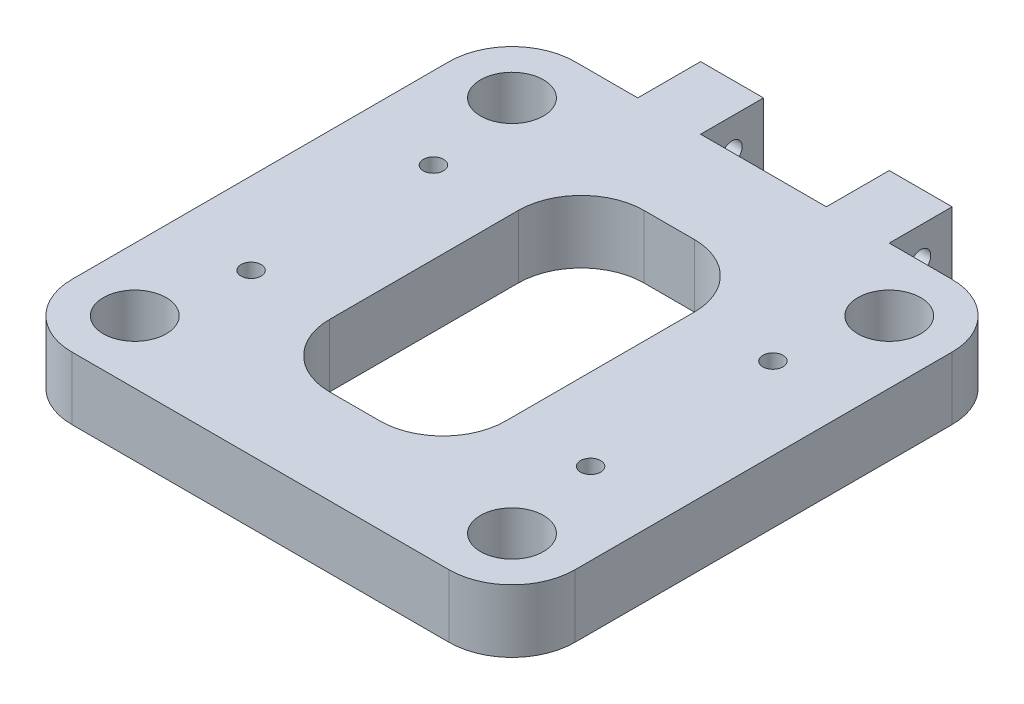
ISO-10303-21;
HEADER;
FILE_DESCRIPTION(('STEP AP214'),'2;1');
FILE_NAME('part.step','',(''),(''),'','','');
FILE_SCHEMA(('AUTOMOTIVE_DESIGN { 1 0 10303 214 1 1 1 1 }'));
ENDSEC;
DATA;
#1=APPLICATION_CONTEXT('core data for automotive mechanical design processes');
#2=APPLICATION_PROTOCOL_DEFINITION('international standard','automotive_design',2000,#1);
#3=PRODUCT_CONTEXT('',#1,'mechanical');
#4=PRODUCT('Part','Part','',(#3));
#5=PRODUCT_RELATED_PRODUCT_CATEGORY('part','',(#4));
#6=PRODUCT_DEFINITION_FORMATION('','',#4);
#7=PRODUCT_DEFINITION_CONTEXT('part definition',#1,'design');
#8=PRODUCT_DEFINITION('design','',#6,#7);
#9=PRODUCT_DEFINITION_SHAPE('','',#8);
#10=(LENGTH_UNIT() NAMED_UNIT(*) SI_UNIT(.MILLI.,.METRE.));
#11=(NAMED_UNIT(*) PLANE_ANGLE_UNIT() SI_UNIT($,.RADIAN.));
#12=(NAMED_UNIT(*) SI_UNIT($,.STERADIAN.) SOLID_ANGLE_UNIT());
#13=UNCERTAINTY_MEASURE_WITH_UNIT(LENGTH_MEASURE(1.E-05),#10,'distance_accuracy_value','');
#14=(GEOMETRIC_REPRESENTATION_CONTEXT(3) GLOBAL_UNCERTAINTY_ASSIGNED_CONTEXT((#13)) GLOBAL_UNIT_ASSIGNED_CONTEXT((#10,
#11,#12)) REPRESENTATION_CONTEXT('',''));
#15=CARTESIAN_POINT('',(0.,0.,0.));
#16=DIRECTION('',(0.,0.,1.));
#17=DIRECTION('',(1.,0.,0.));
#18=AXIS2_PLACEMENT_3D('',#15,#16,#17);
#19=CARTESIAN_POINT('',(-40.,10.,-40.));
#20=DIRECTION('',(0.,0.,1.));
#21=DIRECTION('',(1.,0.,0.));
#22=AXIS2_PLACEMENT_3D('',#19,#20,#21);
#23=PLANE('',#22);
#24=DIRECTION('',(0.,-1.,0.));
#25=VECTOR('',#24,1.);
#26=CARTESIAN_POINT('',(-10.,10.,-40.));
#27=LINE('',#26,#25);
#28=CARTESIAN_POINT('',(-10.,10.,-40.));
#29=VERTEX_POINT('',#28);
#30=CARTESIAN_POINT('',(-10.,0.,-40.));
#31=VERTEX_POINT('',#30);
#32=EDGE_CURVE('E57',#29,#31,#27,.T.);
#33=ORIENTED_EDGE('',*,*,#32,.F.);
#34=DIRECTION('',(-1.,0.,0.));
#35=VECTOR('',#34,1.);
#36=CARTESIAN_POINT('',(-40.,10.,-40.));
#37=LINE('',#36,#35);
#38=CARTESIAN_POINT('',(9.99999999999999,10.,-40.));
#39=VERTEX_POINT('',#38);
#40=EDGE_CURVE('E371',#39,#29,#37,.T.);
#41=ORIENTED_EDGE('',*,*,#40,.F.);
#42=DIRECTION('',(0.,1.,0.));
#43=VECTOR('',#42,1.);
#44=CARTESIAN_POINT('',(10.,10.,-40.));
#45=LINE('',#44,#43);
#46=CARTESIAN_POINT('',(10.,0.,-40.));
#47=VERTEX_POINT('',#46);
#48=EDGE_CURVE('E221',#47,#39,#45,.T.);
#49=ORIENTED_EDGE('',*,*,#48,.F.);
#50=DIRECTION('',(-1.,0.,0.));
#51=VECTOR('',#50,1.);
#52=CARTESIAN_POINT('',(-40.,0.,-40.));
#53=LINE('',#52,#51);
#54=EDGE_CURVE('E384',#47,#31,#53,.T.);
#55=ORIENTED_EDGE('',*,*,#54,.T.);
#56=EDGE_LOOP('',(#33,#41,#49,#55));
#57=FACE_BOUND('',#56,.T.);
#58=ADVANCED_FACE('F33',(#57),#23,.F.);
#59=DIRECTION('',(0.,1.,0.));
#60=VECTOR('',#59,1.);
#61=CARTESIAN_POINT('',(-20.,10.,-40.));
#62=LINE('',#61,#60);
#63=CARTESIAN_POINT('',(-20.,0.,-40.));
#64=VERTEX_POINT('',#63);
#65=CARTESIAN_POINT('',(-20.,10.,-40.));
#66=VERTEX_POINT('',#65);
#67=EDGE_CURVE('E215',#64,#66,#62,.T.);
#68=ORIENTED_EDGE('',*,*,#67,.F.);
#69=CARTESIAN_POINT('',(-30.,0.,-40.));
#70=VERTEX_POINT('',#69);
#71=EDGE_CURVE('E380',#64,#70,#53,.T.);
#72=ORIENTED_EDGE('',*,*,#71,.T.);
#73=DIRECTION('',(0.,-1.,0.));
#74=VECTOR('',#73,1.);
#75=CARTESIAN_POINT('',(-30.,10.,-40.));
#76=LINE('',#75,#74);
#77=CARTESIAN_POINT('',(-30.,10.,-40.));
#78=VERTEX_POINT('',#77);
#79=EDGE_CURVE('E405',#70,#78,#76,.F.);
#80=ORIENTED_EDGE('',*,*,#79,.T.);
#81=EDGE_CURVE('E49',#66,#78,#37,.T.);
#82=ORIENTED_EDGE('',*,*,#81,.F.);
#83=EDGE_LOOP('',(#68,#72,#80,#82));
#84=FACE_BOUND('',#83,.T.);
#85=ADVANCED_FACE('F498',(#84),#23,.F.);
#86=DIRECTION('',(0.,-1.,0.));
#87=VECTOR('',#86,1.);
#88=CARTESIAN_POINT('',(20.,10.,-40.));
#89=LINE('',#88,#87);
#90=CARTESIAN_POINT('',(20.,10.,-40.));
#91=VERTEX_POINT('',#90);
#92=CARTESIAN_POINT('',(20.,0.,-40.));
#93=VERTEX_POINT('',#92);
#94=EDGE_CURVE('E218',#91,#93,#89,.T.);
#95=ORIENTED_EDGE('',*,*,#94,.F.);
#96=CARTESIAN_POINT('',(30.,10.,-40.));
#97=VERTEX_POINT('',#96);
#98=EDGE_CURVE('E367',#97,#91,#37,.T.);
#99=ORIENTED_EDGE('',*,*,#98,.F.);
#100=DIRECTION('',(0.,-1.,0.));
#101=VECTOR('',#100,1.);
#102=CARTESIAN_POINT('',(30.,10.,-40.));
#103=LINE('',#102,#101);
#104=CARTESIAN_POINT('',(30.,0.,-40.));
#105=VERTEX_POINT('',#104);
#106=EDGE_CURVE('E402',#97,#105,#103,.T.);
#107=ORIENTED_EDGE('',*,*,#106,.T.);
#108=EDGE_CURVE('E381',#105,#93,#53,.T.);
#109=ORIENTED_EDGE('',*,*,#108,.T.);
#110=EDGE_LOOP('',(#95,#99,#107,#109));
#111=FACE_BOUND('',#110,.T.);
#112=ADVANCED_FACE('F447',(#111),#23,.F.);
#113=CARTESIAN_POINT('',(40.,10.,40.));
#114=DIRECTION('',(-1.,0.,0.));
#115=DIRECTION('',(0.,0.,1.));
#116=AXIS2_PLACEMENT_3D('',#113,#114,#115);
#117=PLANE('',#116);
#118=DIRECTION('',(0.,0.,-1.));
#119=VECTOR('',#118,1.);
#120=CARTESIAN_POINT('',(40.,0.,40.));
#121=LINE('',#120,#119);
#122=CARTESIAN_POINT('',(40.,0.,30.));
#123=VERTEX_POINT('',#122);
#124=CARTESIAN_POINT('',(40.,0.,-30.));
#125=VERTEX_POINT('',#124);
#126=EDGE_CURVE('E348',#123,#125,#121,.T.);
#127=ORIENTED_EDGE('',*,*,#126,.T.);
#128=DIRECTION('',(0.,-1.,0.));
#129=VECTOR('',#128,1.);
#130=CARTESIAN_POINT('',(40.,10.,-30.));
#131=LINE('',#130,#129);
#132=CARTESIAN_POINT('',(40.,10.,-30.));
#133=VERTEX_POINT('',#132);
#134=EDGE_CURVE('E418',#125,#133,#131,.F.);
#135=ORIENTED_EDGE('',*,*,#134,.T.);
#136=DIRECTION('',(0.,0.,-1.));
#137=VECTOR('',#136,1.);
#138=CARTESIAN_POINT('',(40.,10.,40.));
#139=LINE('',#138,#137);
#140=CARTESIAN_POINT('',(40.,10.,30.));
#141=VERTEX_POINT('',#140);
#142=EDGE_CURVE('E363',#141,#133,#139,.T.);
#143=ORIENTED_EDGE('',*,*,#142,.F.);
#144=DIRECTION('',(0.,-1.,0.));
#145=VECTOR('',#144,1.);
#146=CARTESIAN_POINT('',(40.,10.,30.));
#147=LINE('',#146,#145);
#148=EDGE_CURVE('E415',#141,#123,#147,.T.);
#149=ORIENTED_EDGE('',*,*,#148,.T.);
#150=EDGE_LOOP('',(#127,#135,#143,#149));
#151=FACE_BOUND('',#150,.T.);
#152=ADVANCED_FACE('F436',(#151),#117,.F.);
#153=CARTESIAN_POINT('',(-40.,10.,40.));
#154=DIRECTION('',(1.,0.,0.));
#155=DIRECTION('',(0.,0.,-1.));
#156=AXIS2_PLACEMENT_3D('',#153,#154,#155);
#157=PLANE('',#156);
#158=DIRECTION('',(0.,0.,1.));
#159=VECTOR('',#158,1.);
#160=CARTESIAN_POINT('',(-40.,10.,40.));
#161=LINE('',#160,#159);
#162=CARTESIAN_POINT('',(-40.,10.,-30.));
#163=VERTEX_POINT('',#162);
#164=CARTESIAN_POINT('',(-40.,10.,30.));
#165=VERTEX_POINT('',#164);
#166=EDGE_CURVE('E370',#163,#165,#161,.T.);
#167=ORIENTED_EDGE('',*,*,#166,.F.);
#168=DIRECTION('',(0.,-1.,0.));
#169=VECTOR('',#168,1.);
#170=CARTESIAN_POINT('',(-40.,10.,-30.));
#171=LINE('',#170,#169);
#172=CARTESIAN_POINT('',(-40.,0.,-30.));
#173=VERTEX_POINT('',#172);
#174=EDGE_CURVE('E390',#163,#173,#171,.T.);
#175=ORIENTED_EDGE('',*,*,#174,.T.);
#176=DIRECTION('',(0.,0.,1.));
#177=VECTOR('',#176,1.);
#178=CARTESIAN_POINT('',(-40.,0.,40.));
#179=LINE('',#178,#177);
#180=CARTESIAN_POINT('',(-40.,0.,30.));
#181=VERTEX_POINT('',#180);
#182=EDGE_CURVE('E383',#173,#181,#179,.T.);
#183=ORIENTED_EDGE('',*,*,#182,.T.);
#184=DIRECTION('',(0.,-1.,0.));
#185=VECTOR('',#184,1.);
#186=CARTESIAN_POINT('',(-40.,10.,30.));
#187=LINE('',#186,#185);
#188=EDGE_CURVE('E377',#181,#165,#187,.F.);
#189=ORIENTED_EDGE('',*,*,#188,.T.);
#190=EDGE_LOOP('',(#167,#175,#183,#189));
#191=FACE_BOUND('',#190,.T.);
#192=ADVANCED_FACE('F509',(#191),#157,.F.);
#193=CARTESIAN_POINT('',(-40.,10.,40.));
#194=DIRECTION('',(0.,0.,-1.));
#195=DIRECTION('',(-1.,0.,0.));
#196=AXIS2_PLACEMENT_3D('',#193,#194,#195);
#197=PLANE('',#196);
#198=DIRECTION('',(1.,0.,0.));
#199=VECTOR('',#198,1.);
#200=CARTESIAN_POINT('',(-40.,0.,40.));
#201=LINE('',#200,#199);
#202=CARTESIAN_POINT('',(-30.,0.,40.));
#203=VERTEX_POINT('',#202);
#204=CARTESIAN_POINT('',(30.,0.,40.));
#205=VERTEX_POINT('',#204);
#206=EDGE_CURVE('E366',#203,#205,#201,.T.);
#207=ORIENTED_EDGE('',*,*,#206,.T.);
#208=DIRECTION('',(0.,-1.,0.));
#209=VECTOR('',#208,1.);
#210=CARTESIAN_POINT('',(30.,10.,40.));
#211=LINE('',#210,#209);
#212=CARTESIAN_POINT('',(30.,10.,40.));
#213=VERTEX_POINT('',#212);
#214=EDGE_CURVE('E11',#205,#213,#211,.F.);
#215=ORIENTED_EDGE('',*,*,#214,.T.);
#216=DIRECTION('',(1.,0.,0.));
#217=VECTOR('',#216,1.);
#218=CARTESIAN_POINT('',(-40.,10.,40.));
#219=LINE('',#218,#217);
#220=CARTESIAN_POINT('',(-30.,10.,40.));
#221=VERTEX_POINT('',#220);
#222=EDGE_CURVE('E374',#221,#213,#219,.T.);
#223=ORIENTED_EDGE('',*,*,#222,.F.);
#224=DIRECTION('',(0.,-1.,0.));
#225=VECTOR('',#224,1.);
#226=CARTESIAN_POINT('',(-30.,10.,40.));
#227=LINE('',#226,#225);
#228=EDGE_CURVE('E42',#221,#203,#227,.T.);
#229=ORIENTED_EDGE('',*,*,#228,.T.);
#230=EDGE_LOOP('',(#207,#215,#223,#229));
#231=FACE_BOUND('',#230,.T.);
#232=ADVANCED_FACE('F425',(#231),#197,.F.);
#233=CARTESIAN_POINT('',(0.,10.,0.));
#234=DIRECTION('',(0.,-1.,0.));
#235=DIRECTION('',(0.,0.,-1.));
#236=AXIS2_PLACEMENT_3D('',#233,#234,#235);
#237=PLANE('',#236);
#238=CARTESIAN_POINT('',(27.,10.,-14.5));
#239=DIRECTION('',(0.,-1.,0.));
#240=DIRECTION('',(0.,0.,-1.));
#241=AXIS2_PLACEMENT_3D('',#238,#239,#240);
#242=CIRCLE('',#241,1.6);
#243=CARTESIAN_POINT('',(27.,10.,-16.1));
#244=VERTEX_POINT('',#243);
#245=EDGE_CURVE('E264',#244,#244,#242,.T.);
#246=ORIENTED_EDGE('',*,*,#245,.T.);
#247=EDGE_LOOP('',(#246));
#248=FACE_BOUND('',#247,.T.);
#249=CARTESIAN_POINT('',(-27.,10.,-14.5));
#250=DIRECTION('',(0.,-1.,0.));
#251=DIRECTION('',(0.,0.,-1.));
#252=AXIS2_PLACEMENT_3D('',#249,#250,#251);
#253=CIRCLE('',#252,1.6);
#254=CARTESIAN_POINT('',(-27.,10.,-16.1));
#255=VERTEX_POINT('',#254);
#256=EDGE_CURVE('E258',#255,#255,#253,.T.);
#257=ORIENTED_EDGE('',*,*,#256,.T.);
#258=EDGE_LOOP('',(#257));
#259=FACE_BOUND('',#258,.T.);
#260=CARTESIAN_POINT('',(-27.,10.,14.5));
#261=DIRECTION('',(0.,-1.,0.));
#262=DIRECTION('',(0.,0.,-1.));
#263=AXIS2_PLACEMENT_3D('',#260,#261,#262);
#264=CIRCLE('',#263,1.6);
#265=CARTESIAN_POINT('',(-27.,10.,12.9));
#266=VERTEX_POINT('',#265);
#267=EDGE_CURVE('E251',#266,#266,#264,.T.);
#268=ORIENTED_EDGE('',*,*,#267,.T.);
#269=EDGE_LOOP('',(#268));
#270=FACE_BOUND('',#269,.T.);
#271=CARTESIAN_POINT('',(27.,10.,14.5));
#272=DIRECTION('',(0.,-1.,0.));
#273=DIRECTION('',(0.,0.,-1.));
#274=AXIS2_PLACEMENT_3D('',#271,#272,#273);
#275=CIRCLE('',#274,1.6);
#276=CARTESIAN_POINT('',(27.,10.,12.9));
#277=VERTEX_POINT('',#276);
#278=EDGE_CURVE('E269',#277,#277,#275,.T.);
#279=ORIENTED_EDGE('',*,*,#278,.T.);
#280=EDGE_LOOP('',(#279));
#281=FACE_BOUND('',#280,.T.);
#282=CARTESIAN_POINT('',(30.,10.,-30.));
#283=DIRECTION('',(0.,1.,0.));
#284=DIRECTION('',(0.,0.,1.));
#285=AXIS2_PLACEMENT_3D('',#282,#283,#284);
#286=CIRCLE('',#285,5.);
#287=CARTESIAN_POINT('',(30.,10.,-25.));
#288=VERTEX_POINT('',#287);
#289=EDGE_CURVE('E285',#288,#288,#286,.T.);
#290=ORIENTED_EDGE('',*,*,#289,.F.);
#291=EDGE_LOOP('',(#290));
#292=FACE_BOUND('',#291,.T.);
#293=CARTESIAN_POINT('',(-30.,10.,30.));
#294=DIRECTION('',(0.,1.,0.));
#295=DIRECTION('',(0.,0.,1.));
#296=AXIS2_PLACEMENT_3D('',#293,#294,#295);
#297=CIRCLE('',#296,5.);
#298=CARTESIAN_POINT('',(-30.,10.,35.));
#299=VERTEX_POINT('',#298);
#300=EDGE_CURVE('E278',#299,#299,#297,.T.);
#301=ORIENTED_EDGE('',*,*,#300,.F.);
#302=EDGE_LOOP('',(#301));
#303=FACE_BOUND('',#302,.T.);
#304=CARTESIAN_POINT('',(30.,10.,30.));
#305=DIRECTION('',(0.,1.,0.));
#306=DIRECTION('',(0.,0.,1.));
#307=AXIS2_PLACEMENT_3D('',#304,#305,#306);
#308=CIRCLE('',#307,5.);
#309=CARTESIAN_POINT('',(30.,10.,35.));
#310=VERTEX_POINT('',#309);
#311=EDGE_CURVE('E272',#310,#310,#308,.T.);
#312=ORIENTED_EDGE('',*,*,#311,.F.);
#313=EDGE_LOOP('',(#312));
#314=FACE_BOUND('',#313,.T.);
#315=CARTESIAN_POINT('',(-30.,10.,-30.));
#316=DIRECTION('',(0.,1.,0.));
#317=DIRECTION('',(0.,0.,1.));
#318=AXIS2_PLACEMENT_3D('',#315,#316,#317);
#319=CIRCLE('',#318,5.);
#320=CARTESIAN_POINT('',(-30.,10.,-25.));
#321=VERTEX_POINT('',#320);
#322=EDGE_CURVE('E284',#321,#321,#319,.T.);
#323=ORIENTED_EDGE('',*,*,#322,.F.);
#324=EDGE_LOOP('',(#323));
#325=FACE_BOUND('',#324,.T.);
#326=DIRECTION('',(0.,0.,-1.));
#327=VECTOR('',#326,1.);
#328=CARTESIAN_POINT('',(14.,10.,15.));
#329=LINE('',#328,#327);
#330=CARTESIAN_POINT('',(14.,10.,15.));
#331=VERTEX_POINT('',#330);
#332=CARTESIAN_POINT('',(14.,10.,-15.));
#333=VERTEX_POINT('',#332);
#334=EDGE_CURVE('E326',#331,#333,#329,.T.);
#335=ORIENTED_EDGE('',*,*,#334,.F.);
#336=CARTESIAN_POINT('',(4.00000000000001,10.,15.));
#337=DIRECTION('',(0.,1.,0.));
#338=DIRECTION('',(0.,0.,1.));
#339=AXIS2_PLACEMENT_3D('',#336,#337,#338);
#340=CIRCLE('',#339,10.);
#341=CARTESIAN_POINT('',(4.00000000000001,10.,25.));
#342=VERTEX_POINT('',#341);
#343=EDGE_CURVE('E296',#342,#331,#340,.T.);
#344=ORIENTED_EDGE('',*,*,#343,.F.);
#345=DIRECTION('',(1.,0.,0.));
#346=VECTOR('',#345,1.);
#347=CARTESIAN_POINT('',(-4.00000000000001,10.,25.));
#348=LINE('',#347,#346);
#349=CARTESIAN_POINT('',(-4.00000000000001,10.,25.));
#350=VERTEX_POINT('',#349);
#351=EDGE_CURVE('E303',#350,#342,#348,.T.);
#352=ORIENTED_EDGE('',*,*,#351,.F.);
#353=CARTESIAN_POINT('',(-4.00000000000001,10.,15.));
#354=DIRECTION('',(0.,1.,0.));
#355=DIRECTION('',(0.,0.,-1.));
#356=AXIS2_PLACEMENT_3D('',#353,#354,#355);
#357=CIRCLE('',#356,10.);
#358=CARTESIAN_POINT('',(-14.,10.,15.));
#359=VERTEX_POINT('',#358);
#360=EDGE_CURVE('E341',#359,#350,#357,.T.);
#361=ORIENTED_EDGE('',*,*,#360,.F.);
#362=DIRECTION('',(0.,0.,1.));
#363=VECTOR('',#362,1.);
#364=CARTESIAN_POINT('',(-14.,10.,15.));
#365=LINE('',#364,#363);
#366=CARTESIAN_POINT('',(-14.,10.,-15.));
#367=VERTEX_POINT('',#366);
#368=EDGE_CURVE('E338',#367,#359,#365,.T.);
#369=ORIENTED_EDGE('',*,*,#368,.F.);
#370=CARTESIAN_POINT('',(-4.00000000000001,10.,-15.));
#371=DIRECTION('',(0.,1.,0.));
#372=DIRECTION('',(0.,0.,-1.));
#373=AXIS2_PLACEMENT_3D('',#370,#371,#372);
#374=CIRCLE('',#373,10.);
#375=CARTESIAN_POINT('',(-4.00000000000001,10.,-25.));
#376=VERTEX_POINT('',#375);
#377=EDGE_CURVE('E335',#376,#367,#374,.T.);
#378=ORIENTED_EDGE('',*,*,#377,.F.);
#379=DIRECTION('',(-1.,0.,0.));
#380=VECTOR('',#379,1.);
#381=CARTESIAN_POINT('',(-4.00000000000001,10.,-25.));
#382=LINE('',#381,#380);
#383=CARTESIAN_POINT('',(4.00000000000001,10.,-25.));
#384=VERTEX_POINT('',#383);
#385=EDGE_CURVE('E332',#384,#376,#382,.T.);
#386=ORIENTED_EDGE('',*,*,#385,.F.);
#387=CARTESIAN_POINT('',(4.00000000000001,10.,-15.));
#388=DIRECTION('',(0.,1.,0.));
#389=DIRECTION('',(0.,0.,-1.));
#390=AXIS2_PLACEMENT_3D('',#387,#388,#389);
#391=CIRCLE('',#390,10.);
#392=EDGE_CURVE('E329',#333,#384,#391,.T.);
#393=ORIENTED_EDGE('',*,*,#392,.F.);
#394=EDGE_LOOP('',(#335,#344,#352,#361,#369,#378,#386,#393));
#395=FACE_BOUND('',#394,.T.);
#396=ORIENTED_EDGE('',*,*,#98,.T.);
#397=DIRECTION('',(0.,0.,1.));
#398=VECTOR('',#397,1.);
#399=CARTESIAN_POINT('',(20.,10.,-50.));
#400=LINE('',#399,#398);
#401=CARTESIAN_POINT('',(20.,10.,-50.));
#402=VERTEX_POINT('',#401);
#403=EDGE_CURVE('E235',#402,#91,#400,.T.);
#404=ORIENTED_EDGE('',*,*,#403,.F.);
#405=DIRECTION('',(1.,0.,0.));
#406=VECTOR('',#405,1.);
#407=CARTESIAN_POINT('',(20.,10.,-50.));
#408=LINE('',#407,#406);
#409=CARTESIAN_POINT('',(10.,10.,-50.));
#410=VERTEX_POINT('',#409);
#411=EDGE_CURVE('E234',#410,#402,#408,.T.);
#412=ORIENTED_EDGE('',*,*,#411,.F.);
#413=DIRECTION('',(0.,0.,1.));
#414=VECTOR('',#413,1.);
#415=CARTESIAN_POINT('',(10.,10.,-50.));
#416=LINE('',#415,#414);
#417=EDGE_CURVE('E241',#410,#39,#416,.T.);
#418=ORIENTED_EDGE('',*,*,#417,.T.);
#419=ORIENTED_EDGE('',*,*,#40,.T.);
#420=DIRECTION('',(0.,0.,1.));
#421=VECTOR('',#420,1.);
#422=CARTESIAN_POINT('',(-10.,10.,-50.));
#423=LINE('',#422,#421);
#424=CARTESIAN_POINT('',(-10.,10.,-50.));
#425=VERTEX_POINT('',#424);
#426=EDGE_CURVE('E462',#425,#29,#423,.T.);
#427=ORIENTED_EDGE('',*,*,#426,.F.);
#428=DIRECTION('',(1.,0.,0.));
#429=VECTOR('',#428,1.);
#430=CARTESIAN_POINT('',(-10.,10.,-50.));
#431=LINE('',#430,#429);
#432=CARTESIAN_POINT('',(-20.,10.,-50.));
#433=VERTEX_POINT('',#432);
#434=EDGE_CURVE('E211',#433,#425,#431,.T.);
#435=ORIENTED_EDGE('',*,*,#434,.F.);
#436=DIRECTION('',(0.,0.,1.));
#437=VECTOR('',#436,1.);
#438=CARTESIAN_POINT('',(-20.,10.,-50.));
#439=LINE('',#438,#437);
#440=EDGE_CURVE('E223',#433,#66,#439,.T.);
#441=ORIENTED_EDGE('',*,*,#440,.T.);
#442=ORIENTED_EDGE('',*,*,#81,.T.);
#443=CARTESIAN_POINT('',(-30.,10.,-30.));
#444=DIRECTION('',(0.,-1.,0.));
#445=DIRECTION('',(0.,0.,-1.));
#446=AXIS2_PLACEMENT_3D('',#443,#444,#445);
#447=CIRCLE('',#446,10.);
#448=EDGE_CURVE('E413',#78,#163,#447,.F.);
#449=ORIENTED_EDGE('',*,*,#448,.T.);
#450=ORIENTED_EDGE('',*,*,#166,.T.);
#451=CARTESIAN_POINT('',(-30.,10.,30.));
#452=DIRECTION('',(0.,-1.,0.));
#453=DIRECTION('',(0.,0.,-1.));
#454=AXIS2_PLACEMENT_3D('',#451,#452,#453);
#455=CIRCLE('',#454,10.);
#456=EDGE_CURVE('E407',#165,#221,#455,.F.);
#457=ORIENTED_EDGE('',*,*,#456,.T.);
#458=ORIENTED_EDGE('',*,*,#222,.T.);
#459=CARTESIAN_POINT('',(30.,10.,30.));
#460=DIRECTION('',(0.,-1.,0.));
#461=DIRECTION('',(0.,0.,-1.));
#462=AXIS2_PLACEMENT_3D('',#459,#460,#461);
#463=CIRCLE('',#462,10.);
#464=EDGE_CURVE('E409',#213,#141,#463,.F.);
#465=ORIENTED_EDGE('',*,*,#464,.T.);
#466=ORIENTED_EDGE('',*,*,#142,.T.);
#467=CARTESIAN_POINT('',(30.,10.,-30.));
#468=DIRECTION('',(0.,-1.,0.));
#469=DIRECTION('',(0.,0.,-1.));
#470=AXIS2_PLACEMENT_3D('',#467,#468,#469);
#471=CIRCLE('',#470,10.);
#472=EDGE_CURVE('E411',#133,#97,#471,.F.);
#473=ORIENTED_EDGE('',*,*,#472,.T.);
#474=EDGE_LOOP('',(#396,#404,#412,#418,#419,#427,#435,#441,#442,#449,#450,#457,#458,#465,#466,#473));
#475=FACE_BOUND('',#474,.T.);
#476=ADVANCED_FACE('F440',(#248,#259,#270,#281,#292,#303,#314,#325,#395,#475),#237,.F.);
#477=CARTESIAN_POINT('',(0.,0.,0.));
#478=DIRECTION('',(0.,-1.,0.));
#479=DIRECTION('',(0.,0.,-1.));
#480=AXIS2_PLACEMENT_3D('',#477,#478,#479);
#481=PLANE('',#480);
#482=CARTESIAN_POINT('',(27.,0.,-14.5));
#483=DIRECTION('',(0.,-1.,0.));
#484=DIRECTION('',(0.,0.,-1.));
#485=AXIS2_PLACEMENT_3D('',#482,#483,#484);
#486=CIRCLE('',#485,1.6);
#487=CARTESIAN_POINT('',(27.,0.,-16.1));
#488=VERTEX_POINT('',#487);
#489=EDGE_CURVE('E250',#488,#488,#486,.T.);
#490=ORIENTED_EDGE('',*,*,#489,.F.);
#491=EDGE_LOOP('',(#490));
#492=FACE_BOUND('',#491,.T.);
#493=CARTESIAN_POINT('',(-27.,0.,-14.5));
#494=DIRECTION('',(0.,-1.,0.));
#495=DIRECTION('',(0.,0.,-1.));
#496=AXIS2_PLACEMENT_3D('',#493,#494,#495);
#497=CIRCLE('',#496,1.6);
#498=CARTESIAN_POINT('',(-27.,0.,-16.1));
#499=VERTEX_POINT('',#498);
#500=EDGE_CURVE('E261',#499,#499,#497,.T.);
#501=ORIENTED_EDGE('',*,*,#500,.F.);
#502=EDGE_LOOP('',(#501));
#503=FACE_BOUND('',#502,.T.);
#504=CARTESIAN_POINT('',(-27.,0.,14.5));
#505=DIRECTION('',(0.,-1.,0.));
#506=DIRECTION('',(0.,0.,-1.));
#507=AXIS2_PLACEMENT_3D('',#504,#505,#506);
#508=CIRCLE('',#507,1.6);
#509=CARTESIAN_POINT('',(-27.,0.,12.9));
#510=VERTEX_POINT('',#509);
#511=EDGE_CURVE('E255',#510,#510,#508,.T.);
#512=ORIENTED_EDGE('',*,*,#511,.F.);
#513=EDGE_LOOP('',(#512));
#514=FACE_BOUND('',#513,.T.);
#515=CARTESIAN_POINT('',(27.,0.,14.5));
#516=DIRECTION('',(0.,-1.,0.));
#517=DIRECTION('',(0.,0.,-1.));
#518=AXIS2_PLACEMENT_3D('',#515,#516,#517);
#519=CIRCLE('',#518,1.6);
#520=CARTESIAN_POINT('',(27.,0.,12.9));
#521=VERTEX_POINT('',#520);
#522=EDGE_CURVE('E254',#521,#521,#519,.T.);
#523=ORIENTED_EDGE('',*,*,#522,.F.);
#524=EDGE_LOOP('',(#523));
#525=FACE_BOUND('',#524,.T.);
#526=CARTESIAN_POINT('',(30.,0.,-30.));
#527=DIRECTION('',(0.,1.,0.));
#528=DIRECTION('',(0.,0.,1.));
#529=AXIS2_PLACEMENT_3D('',#526,#527,#528);
#530=CIRCLE('',#529,5.);
#531=CARTESIAN_POINT('',(30.,0.,-25.));
#532=VERTEX_POINT('',#531);
#533=EDGE_CURVE('E281',#532,#532,#530,.T.);
#534=ORIENTED_EDGE('',*,*,#533,.T.);
#535=EDGE_LOOP('',(#534));
#536=FACE_BOUND('',#535,.T.);
#537=CARTESIAN_POINT('',(-30.,0.,30.));
#538=DIRECTION('',(0.,1.,0.));
#539=DIRECTION('',(0.,0.,1.));
#540=AXIS2_PLACEMENT_3D('',#537,#538,#539);
#541=CIRCLE('',#540,5.);
#542=CARTESIAN_POINT('',(-30.,0.,35.));
#543=VERTEX_POINT('',#542);
#544=EDGE_CURVE('E288',#543,#543,#541,.T.);
#545=ORIENTED_EDGE('',*,*,#544,.T.);
#546=EDGE_LOOP('',(#545));
#547=FACE_BOUND('',#546,.T.);
#548=CARTESIAN_POINT('',(30.,0.,30.));
#549=DIRECTION('',(0.,1.,0.));
#550=DIRECTION('',(0.,0.,1.));
#551=AXIS2_PLACEMENT_3D('',#548,#549,#550);
#552=CIRCLE('',#551,5.);
#553=CARTESIAN_POINT('',(30.,0.,35.));
#554=VERTEX_POINT('',#553);
#555=EDGE_CURVE('E275',#554,#554,#552,.T.);
#556=ORIENTED_EDGE('',*,*,#555,.T.);
#557=EDGE_LOOP('',(#556));
#558=FACE_BOUND('',#557,.T.);
#559=CARTESIAN_POINT('',(-30.,0.,-30.));
#560=DIRECTION('',(0.,1.,0.));
#561=DIRECTION('',(0.,0.,1.));
#562=AXIS2_PLACEMENT_3D('',#559,#560,#561);
#563=CIRCLE('',#562,5.);
#564=CARTESIAN_POINT('',(-30.,0.,-25.));
#565=VERTEX_POINT('',#564);
#566=EDGE_CURVE('E293',#565,#565,#563,.T.);
#567=ORIENTED_EDGE('',*,*,#566,.T.);
#568=EDGE_LOOP('',(#567));
#569=FACE_BOUND('',#568,.T.);
#570=CARTESIAN_POINT('',(4.00000000000001,0.,15.));
#571=DIRECTION('',(0.,1.,0.));
#572=DIRECTION('',(0.,0.,1.));
#573=AXIS2_PLACEMENT_3D('',#570,#571,#572);
#574=CIRCLE('',#573,10.);
#575=CARTESIAN_POINT('',(4.00000000000001,0.,25.));
#576=VERTEX_POINT('',#575);
#577=CARTESIAN_POINT('',(14.,0.,15.));
#578=VERTEX_POINT('',#577);
#579=EDGE_CURVE('E299',#576,#578,#574,.T.);
#580=ORIENTED_EDGE('',*,*,#579,.T.);
#581=DIRECTION('',(0.,0.,-1.));
#582=VECTOR('',#581,1.);
#583=CARTESIAN_POINT('',(14.,0.,15.));
#584=LINE('',#583,#582);
#585=CARTESIAN_POINT('',(14.,0.,-15.));
#586=VERTEX_POINT('',#585);
#587=EDGE_CURVE('E302',#578,#586,#584,.T.);
#588=ORIENTED_EDGE('',*,*,#587,.T.);
#589=CARTESIAN_POINT('',(4.00000000000001,0.,-15.));
#590=DIRECTION('',(0.,1.,0.));
#591=DIRECTION('',(0.,0.,-1.));
#592=AXIS2_PLACEMENT_3D('',#589,#590,#591);
#593=CIRCLE('',#592,10.);
#594=CARTESIAN_POINT('',(4.00000000000001,0.,-25.));
#595=VERTEX_POINT('',#594);
#596=EDGE_CURVE('E306',#586,#595,#593,.T.);
#597=ORIENTED_EDGE('',*,*,#596,.T.);
#598=DIRECTION('',(-1.,0.,0.));
#599=VECTOR('',#598,1.);
#600=CARTESIAN_POINT('',(-4.00000000000001,0.,-25.));
#601=LINE('',#600,#599);
#602=CARTESIAN_POINT('',(-4.00000000000001,0.,-25.));
#603=VERTEX_POINT('',#602);
#604=EDGE_CURVE('E309',#595,#603,#601,.T.);
#605=ORIENTED_EDGE('',*,*,#604,.T.);
#606=CARTESIAN_POINT('',(-4.00000000000001,0.,-15.));
#607=DIRECTION('',(0.,1.,0.));
#608=DIRECTION('',(0.,0.,-1.));
#609=AXIS2_PLACEMENT_3D('',#606,#607,#608);
#610=CIRCLE('',#609,10.);
#611=CARTESIAN_POINT('',(-14.,0.,-15.));
#612=VERTEX_POINT('',#611);
#613=EDGE_CURVE('E312',#603,#612,#610,.T.);
#614=ORIENTED_EDGE('',*,*,#613,.T.);
#615=DIRECTION('',(0.,0.,1.));
#616=VECTOR('',#615,1.);
#617=CARTESIAN_POINT('',(-14.,0.,15.));
#618=LINE('',#617,#616);
#619=CARTESIAN_POINT('',(-14.,0.,15.));
#620=VERTEX_POINT('',#619);
#621=EDGE_CURVE('E315',#612,#620,#618,.T.);
#622=ORIENTED_EDGE('',*,*,#621,.T.);
#623=CARTESIAN_POINT('',(-4.00000000000001,0.,15.));
#624=DIRECTION('',(0.,1.,0.));
#625=DIRECTION('',(0.,0.,-1.));
#626=AXIS2_PLACEMENT_3D('',#623,#624,#625);
#627=CIRCLE('',#626,10.);
#628=CARTESIAN_POINT('',(-4.00000000000001,0.,25.));
#629=VERTEX_POINT('',#628);
#630=EDGE_CURVE('E318',#620,#629,#627,.T.);
#631=ORIENTED_EDGE('',*,*,#630,.T.);
#632=DIRECTION('',(1.,0.,0.));
#633=VECTOR('',#632,1.);
#634=CARTESIAN_POINT('',(-4.00000000000001,0.,25.));
#635=LINE('',#634,#633);
#636=EDGE_CURVE('E321',#629,#576,#635,.T.);
#637=ORIENTED_EDGE('',*,*,#636,.T.);
#638=EDGE_LOOP('',(#580,#588,#597,#605,#614,#622,#631,#637));
#639=FACE_BOUND('',#638,.T.);
#640=ORIENTED_EDGE('',*,*,#182,.F.);
#641=CARTESIAN_POINT('',(-30.,0.,-30.));
#642=DIRECTION('',(0.,-1.,0.));
#643=DIRECTION('',(0.,0.,-1.));
#644=AXIS2_PLACEMENT_3D('',#641,#642,#643);
#645=CIRCLE('',#644,10.);
#646=EDGE_CURVE('E399',#173,#70,#645,.T.);
#647=ORIENTED_EDGE('',*,*,#646,.T.);
#648=ORIENTED_EDGE('',*,*,#71,.F.);
#649=DIRECTION('',(0.,0.,1.));
#650=VECTOR('',#649,1.);
#651=CARTESIAN_POINT('',(-20.,0.,-50.));
#652=LINE('',#651,#650);
#653=CARTESIAN_POINT('',(-20.,0.,-50.));
#654=VERTEX_POINT('',#653);
#655=EDGE_CURVE('E202',#654,#64,#652,.T.);
#656=ORIENTED_EDGE('',*,*,#655,.F.);
#657=DIRECTION('',(-1.,0.,0.));
#658=VECTOR('',#657,1.);
#659=CARTESIAN_POINT('',(-10.,0.,-50.));
#660=LINE('',#659,#658);
#661=CARTESIAN_POINT('',(-10.,0.,-50.));
#662=VERTEX_POINT('',#661);
#663=EDGE_CURVE('E195',#662,#654,#660,.T.);
#664=ORIENTED_EDGE('',*,*,#663,.F.);
#665=DIRECTION('',(0.,0.,1.));
#666=VECTOR('',#665,1.);
#667=CARTESIAN_POINT('',(-10.,0.,-50.));
#668=LINE('',#667,#666);
#669=EDGE_CURVE('E200',#662,#31,#668,.T.);
#670=ORIENTED_EDGE('',*,*,#669,.T.);
#671=ORIENTED_EDGE('',*,*,#54,.F.);
#672=DIRECTION('',(0.,0.,1.));
#673=VECTOR('',#672,1.);
#674=CARTESIAN_POINT('',(10.,0.,-50.));
#675=LINE('',#674,#673);
#676=CARTESIAN_POINT('',(10.,0.,-50.));
#677=VERTEX_POINT('',#676);
#678=EDGE_CURVE('E244',#677,#47,#675,.T.);
#679=ORIENTED_EDGE('',*,*,#678,.F.);
#680=DIRECTION('',(-1.,0.,0.));
#681=VECTOR('',#680,1.);
#682=CARTESIAN_POINT('',(20.,0.,-50.));
#683=LINE('',#682,#681);
#684=CARTESIAN_POINT('',(20.,0.,-50.));
#685=VERTEX_POINT('',#684);
#686=EDGE_CURVE('E230',#685,#677,#683,.T.);
#687=ORIENTED_EDGE('',*,*,#686,.F.);
#688=DIRECTION('',(0.,0.,1.));
#689=VECTOR('',#688,1.);
#690=CARTESIAN_POINT('',(20.,0.,-50.));
#691=LINE('',#690,#689);
#692=EDGE_CURVE('E247',#685,#93,#691,.T.);
#693=ORIENTED_EDGE('',*,*,#692,.T.);
#694=ORIENTED_EDGE('',*,*,#108,.F.);
#695=CARTESIAN_POINT('',(30.,0.,-30.));
#696=DIRECTION('',(0.,-1.,0.));
#697=DIRECTION('',(0.,0.,-1.));
#698=AXIS2_PLACEMENT_3D('',#695,#696,#697);
#699=CIRCLE('',#698,10.);
#700=EDGE_CURVE('E397',#105,#125,#699,.T.);
#701=ORIENTED_EDGE('',*,*,#700,.T.);
#702=ORIENTED_EDGE('',*,*,#126,.F.);
#703=CARTESIAN_POINT('',(30.,0.,30.));
#704=DIRECTION('',(0.,-1.,0.));
#705=DIRECTION('',(0.,0.,-1.));
#706=AXIS2_PLACEMENT_3D('',#703,#704,#705);
#707=CIRCLE('',#706,10.);
#708=EDGE_CURVE('E395',#123,#205,#707,.T.);
#709=ORIENTED_EDGE('',*,*,#708,.T.);
#710=ORIENTED_EDGE('',*,*,#206,.F.);
#711=CARTESIAN_POINT('',(-30.,0.,30.));
#712=DIRECTION('',(0.,-1.,0.));
#713=DIRECTION('',(0.,0.,-1.));
#714=AXIS2_PLACEMENT_3D('',#711,#712,#713);
#715=CIRCLE('',#714,10.);
#716=EDGE_CURVE('E393',#203,#181,#715,.T.);
#717=ORIENTED_EDGE('',*,*,#716,.T.);
#718=EDGE_LOOP('',(#640,#647,#648,#656,#664,#670,#671,#679,#687,#693,#694,#701,#702,#709,#710,#717));
#719=FACE_BOUND('',#718,.T.);
#720=ADVANCED_FACE('F198',(#492,#503,#514,#525,#536,#547,#558,#569,#639,#719),#481,.T.);
#721=CARTESIAN_POINT('',(-30.,10.,-30.));
#722=DIRECTION('',(0.,-1.,0.));
#723=DIRECTION('',(0.,0.,-1.));
#724=AXIS2_PLACEMENT_3D('',#721,#722,#723);
#725=CYLINDRICAL_SURFACE('',#724,10.);
#726=ORIENTED_EDGE('',*,*,#448,.F.);
#727=ORIENTED_EDGE('',*,*,#79,.F.);
#728=ORIENTED_EDGE('',*,*,#646,.F.);
#729=ORIENTED_EDGE('',*,*,#174,.F.);
#730=EDGE_LOOP('',(#726,#727,#728,#729));
#731=FACE_BOUND('',#730,.T.);
#732=ADVANCED_FACE('F515',(#731),#725,.T.);
#733=CARTESIAN_POINT('',(30.,10.,-30.));
#734=DIRECTION('',(0.,-1.,0.));
#735=DIRECTION('',(0.,0.,-1.));
#736=AXIS2_PLACEMENT_3D('',#733,#734,#735);
#737=CYLINDRICAL_SURFACE('',#736,10.);
#738=ORIENTED_EDGE('',*,*,#472,.F.);
#739=ORIENTED_EDGE('',*,*,#134,.F.);
#740=ORIENTED_EDGE('',*,*,#700,.F.);
#741=ORIENTED_EDGE('',*,*,#106,.F.);
#742=EDGE_LOOP('',(#738,#739,#740,#741));
#743=FACE_BOUND('',#742,.T.);
#744=ADVANCED_FACE('F444',(#743),#737,.T.);
#745=CARTESIAN_POINT('',(30.,10.,30.));
#746=DIRECTION('',(0.,-1.,0.));
#747=DIRECTION('',(0.,0.,-1.));
#748=AXIS2_PLACEMENT_3D('',#745,#746,#747);
#749=CYLINDRICAL_SURFACE('',#748,10.);
#750=ORIENTED_EDGE('',*,*,#464,.F.);
#751=ORIENTED_EDGE('',*,*,#214,.F.);
#752=ORIENTED_EDGE('',*,*,#708,.F.);
#753=ORIENTED_EDGE('',*,*,#148,.F.);
#754=EDGE_LOOP('',(#750,#751,#752,#753));
#755=FACE_BOUND('',#754,.T.);
#756=ADVANCED_FACE('F433',(#755),#749,.T.);
#757=CARTESIAN_POINT('',(-30.,10.,30.));
#758=DIRECTION('',(0.,-1.,0.));
#759=DIRECTION('',(0.,0.,-1.));
#760=AXIS2_PLACEMENT_3D('',#757,#758,#759);
#761=CYLINDRICAL_SURFACE('',#760,10.);
#762=ORIENTED_EDGE('',*,*,#456,.F.);
#763=ORIENTED_EDGE('',*,*,#188,.F.);
#764=ORIENTED_EDGE('',*,*,#716,.F.);
#765=ORIENTED_EDGE('',*,*,#228,.F.);
#766=EDGE_LOOP('',(#762,#763,#764,#765));
#767=FACE_BOUND('',#766,.T.);
#768=ADVANCED_FACE('F35',(#767),#761,.T.);
#769=CARTESIAN_POINT('',(4.00000000000001,0.,15.));
#770=DIRECTION('',(0.,1.,0.));
#771=DIRECTION('',(0.,0.,1.));
#772=AXIS2_PLACEMENT_3D('',#769,#770,#771);
#773=CYLINDRICAL_SURFACE('',#772,10.);
#774=ORIENTED_EDGE('',*,*,#343,.T.);
#775=DIRECTION('',(0.,1.,0.));
#776=VECTOR('',#775,1.);
#777=CARTESIAN_POINT('',(14.,0.,15.));
#778=LINE('',#777,#776);
#779=EDGE_CURVE('E324',#578,#331,#778,.T.);
#780=ORIENTED_EDGE('',*,*,#779,.F.);
#781=ORIENTED_EDGE('',*,*,#579,.F.);
#782=DIRECTION('',(0.,1.,0.));
#783=VECTOR('',#782,1.);
#784=CARTESIAN_POINT('',(4.00000000000001,0.,25.));
#785=LINE('',#784,#783);
#786=EDGE_CURVE('E346',#576,#342,#785,.T.);
#787=ORIENTED_EDGE('',*,*,#786,.T.);
#788=EDGE_LOOP('',(#774,#780,#781,#787));
#789=FACE_BOUND('',#788,.T.);
#790=ADVANCED_FACE('F524',(#789),#773,.F.);
#791=CARTESIAN_POINT('',(-4.00000000000001,0.,25.));
#792=DIRECTION('',(0.,0.,1.));
#793=DIRECTION('',(1.,0.,0.));
#794=AXIS2_PLACEMENT_3D('',#791,#792,#793);
#795=PLANE('',#794);
#796=ORIENTED_EDGE('',*,*,#351,.T.);
#797=ORIENTED_EDGE('',*,*,#786,.F.);
#798=ORIENTED_EDGE('',*,*,#636,.F.);
#799=DIRECTION('',(0.,1.,0.));
#800=VECTOR('',#799,1.);
#801=CARTESIAN_POINT('',(-4.00000000000001,0.,25.));
#802=LINE('',#801,#800);
#803=EDGE_CURVE('E349',#629,#350,#802,.T.);
#804=ORIENTED_EDGE('',*,*,#803,.T.);
#805=EDGE_LOOP('',(#796,#797,#798,#804));
#806=FACE_BOUND('',#805,.T.);
#807=ADVANCED_FACE('F528',(#806),#795,.F.);
#808=CARTESIAN_POINT('',(-4.00000000000001,0.,15.));
#809=DIRECTION('',(0.,1.,0.));
#810=DIRECTION('',(0.,0.,1.));
#811=AXIS2_PLACEMENT_3D('',#808,#809,#810);
#812=CYLINDRICAL_SURFACE('',#811,10.);
#813=ORIENTED_EDGE('',*,*,#360,.T.);
#814=ORIENTED_EDGE('',*,*,#803,.F.);
#815=ORIENTED_EDGE('',*,*,#630,.F.);
#816=DIRECTION('',(0.,1.,0.));
#817=VECTOR('',#816,1.);
#818=CARTESIAN_POINT('',(-14.,0.,15.));
#819=LINE('',#818,#817);
#820=EDGE_CURVE('E351',#620,#359,#819,.T.);
#821=ORIENTED_EDGE('',*,*,#820,.T.);
#822=EDGE_LOOP('',(#813,#814,#815,#821));
#823=FACE_BOUND('',#822,.T.);
#824=ADVANCED_FACE('F587',(#823),#812,.F.);
#825=CARTESIAN_POINT('',(-14.,0.,15.));
#826=DIRECTION('',(-1.,0.,0.));
#827=DIRECTION('',(0.,0.,1.));
#828=AXIS2_PLACEMENT_3D('',#825,#826,#827);
#829=PLANE('',#828);
#830=ORIENTED_EDGE('',*,*,#368,.T.);
#831=ORIENTED_EDGE('',*,*,#820,.F.);
#832=ORIENTED_EDGE('',*,*,#621,.F.);
#833=DIRECTION('',(0.,1.,0.));
#834=VECTOR('',#833,1.);
#835=CARTESIAN_POINT('',(-14.,0.,-15.));
#836=LINE('',#835,#834);
#837=EDGE_CURVE('E353',#612,#367,#836,.T.);
#838=ORIENTED_EDGE('',*,*,#837,.T.);
#839=EDGE_LOOP('',(#830,#831,#832,#838));
#840=FACE_BOUND('',#839,.T.);
#841=ADVANCED_FACE('F591',(#840),#829,.F.);
#842=CARTESIAN_POINT('',(-4.00000000000001,0.,-15.));
#843=DIRECTION('',(0.,1.,0.));
#844=DIRECTION('',(0.,0.,1.));
#845=AXIS2_PLACEMENT_3D('',#842,#843,#844);
#846=CYLINDRICAL_SURFACE('',#845,10.);
#847=ORIENTED_EDGE('',*,*,#377,.T.);
#848=ORIENTED_EDGE('',*,*,#837,.F.);
#849=ORIENTED_EDGE('',*,*,#613,.F.);
#850=DIRECTION('',(0.,1.,0.));
#851=VECTOR('',#850,1.);
#852=CARTESIAN_POINT('',(-4.00000000000001,0.,-25.));
#853=LINE('',#852,#851);
#854=EDGE_CURVE('E355',#603,#376,#853,.T.);
#855=ORIENTED_EDGE('',*,*,#854,.T.);
#856=EDGE_LOOP('',(#847,#848,#849,#855));
#857=FACE_BOUND('',#856,.T.);
#858=ADVANCED_FACE('F595',(#857),#846,.F.);
#859=CARTESIAN_POINT('',(-4.00000000000001,0.,-25.));
#860=DIRECTION('',(0.,0.,-1.));
#861=DIRECTION('',(-1.,0.,0.));
#862=AXIS2_PLACEMENT_3D('',#859,#860,#861);
#863=PLANE('',#862);
#864=ORIENTED_EDGE('',*,*,#385,.T.);
#865=ORIENTED_EDGE('',*,*,#854,.F.);
#866=ORIENTED_EDGE('',*,*,#604,.F.);
#867=DIRECTION('',(0.,1.,0.));
#868=VECTOR('',#867,1.);
#869=CARTESIAN_POINT('',(4.00000000000001,0.,-25.));
#870=LINE('',#869,#868);
#871=EDGE_CURVE('E357',#595,#384,#870,.T.);
#872=ORIENTED_EDGE('',*,*,#871,.T.);
#873=EDGE_LOOP('',(#864,#865,#866,#872));
#874=FACE_BOUND('',#873,.T.);
#875=ADVANCED_FACE('F599',(#874),#863,.F.);
#876=CARTESIAN_POINT('',(4.00000000000001,0.,-15.));
#877=DIRECTION('',(0.,1.,0.));
#878=DIRECTION('',(0.,0.,1.));
#879=AXIS2_PLACEMENT_3D('',#876,#877,#878);
#880=CYLINDRICAL_SURFACE('',#879,10.);
#881=ORIENTED_EDGE('',*,*,#392,.T.);
#882=ORIENTED_EDGE('',*,*,#871,.F.);
#883=ORIENTED_EDGE('',*,*,#596,.F.);
#884=DIRECTION('',(0.,1.,0.));
#885=VECTOR('',#884,1.);
#886=CARTESIAN_POINT('',(14.,0.,-15.));
#887=LINE('',#886,#885);
#888=EDGE_CURVE('E359',#586,#333,#887,.T.);
#889=ORIENTED_EDGE('',*,*,#888,.T.);
#890=EDGE_LOOP('',(#881,#882,#883,#889));
#891=FACE_BOUND('',#890,.T.);
#892=ADVANCED_FACE('F603',(#891),#880,.F.);
#893=CARTESIAN_POINT('',(14.,0.,15.));
#894=DIRECTION('',(1.,0.,0.));
#895=DIRECTION('',(0.,0.,-1.));
#896=AXIS2_PLACEMENT_3D('',#893,#894,#895);
#897=PLANE('',#896);
#898=ORIENTED_EDGE('',*,*,#334,.T.);
#899=ORIENTED_EDGE('',*,*,#888,.F.);
#900=ORIENTED_EDGE('',*,*,#587,.F.);
#901=ORIENTED_EDGE('',*,*,#779,.T.);
#902=EDGE_LOOP('',(#898,#899,#900,#901));
#903=FACE_BOUND('',#902,.T.);
#904=ADVANCED_FACE('F583',(#903),#897,.F.);
#905=CARTESIAN_POINT('',(-30.,0.,-30.));
#906=DIRECTION('',(0.,1.,0.));
#907=DIRECTION('',(0.,0.,1.));
#908=AXIS2_PLACEMENT_3D('',#905,#906,#907);
#909=CYLINDRICAL_SURFACE('',#908,5.);
#910=ORIENTED_EDGE('',*,*,#566,.F.);
#911=EDGE_LOOP('',(#910));
#912=FACE_BOUND('',#911,.T.);
#913=ORIENTED_EDGE('',*,*,#322,.T.);
#914=EDGE_LOOP('',(#913));
#915=FACE_BOUND('',#914,.T.);
#916=ADVANCED_FACE('F573',(#912,#915),#909,.F.);
#917=CARTESIAN_POINT('',(30.,0.,30.));
#918=DIRECTION('',(0.,1.,0.));
#919=DIRECTION('',(0.,0.,1.));
#920=AXIS2_PLACEMENT_3D('',#917,#918,#919);
#921=CYLINDRICAL_SURFACE('',#920,5.);
#922=ORIENTED_EDGE('',*,*,#555,.F.);
#923=EDGE_LOOP('',(#922));
#924=FACE_BOUND('',#923,.T.);
#925=ORIENTED_EDGE('',*,*,#311,.T.);
#926=EDGE_LOOP('',(#925));
#927=FACE_BOUND('',#926,.T.);
#928=ADVANCED_FACE('F569',(#924,#927),#921,.F.);
#929=CARTESIAN_POINT('',(-30.,0.,30.));
#930=DIRECTION('',(0.,1.,0.));
#931=DIRECTION('',(0.,0.,1.));
#932=AXIS2_PLACEMENT_3D('',#929,#930,#931);
#933=CYLINDRICAL_SURFACE('',#932,5.);
#934=ORIENTED_EDGE('',*,*,#544,.F.);
#935=EDGE_LOOP('',(#934));
#936=FACE_BOUND('',#935,.T.);
#937=ORIENTED_EDGE('',*,*,#300,.T.);
#938=EDGE_LOOP('',(#937));
#939=FACE_BOUND('',#938,.T.);
#940=ADVANCED_FACE('F572',(#936,#939),#933,.F.);
#941=CARTESIAN_POINT('',(30.,0.,-30.));
#942=DIRECTION('',(0.,1.,0.));
#943=DIRECTION('',(0.,0.,1.));
#944=AXIS2_PLACEMENT_3D('',#941,#942,#943);
#945=CYLINDRICAL_SURFACE('',#944,5.);
#946=ORIENTED_EDGE('',*,*,#533,.F.);
#947=EDGE_LOOP('',(#946));
#948=FACE_BOUND('',#947,.T.);
#949=ORIENTED_EDGE('',*,*,#289,.T.);
#950=EDGE_LOOP('',(#949));
#951=FACE_BOUND('',#950,.T.);
#952=ADVANCED_FACE('F567',(#948,#951),#945,.F.);
#953=CARTESIAN_POINT('',(27.,10.,14.5));
#954=DIRECTION('',(0.,-1.,0.));
#955=DIRECTION('',(0.,0.,-1.));
#956=AXIS2_PLACEMENT_3D('',#953,#954,#955);
#957=CYLINDRICAL_SURFACE('',#956,1.6);
#958=ORIENTED_EDGE('',*,*,#278,.F.);
#959=EDGE_LOOP('',(#958));
#960=FACE_BOUND('',#959,.T.);
#961=ORIENTED_EDGE('',*,*,#522,.T.);
#962=EDGE_LOOP('',(#961));
#963=FACE_BOUND('',#962,.T.);
#964=ADVANCED_FACE('F557',(#960,#963),#957,.F.);
#965=CARTESIAN_POINT('',(-27.,10.,14.5));
#966=DIRECTION('',(0.,-1.,0.));
#967=DIRECTION('',(0.,0.,-1.));
#968=AXIS2_PLACEMENT_3D('',#965,#966,#967);
#969=CYLINDRICAL_SURFACE('',#968,1.6);
#970=ORIENTED_EDGE('',*,*,#267,.F.);
#971=EDGE_LOOP('',(#970));
#972=FACE_BOUND('',#971,.T.);
#973=ORIENTED_EDGE('',*,*,#511,.T.);
#974=EDGE_LOOP('',(#973));
#975=FACE_BOUND('',#974,.T.);
#976=ADVANCED_FACE('F553',(#972,#975),#969,.F.);
#977=CARTESIAN_POINT('',(-27.,10.,-14.5));
#978=DIRECTION('',(0.,-1.,0.));
#979=DIRECTION('',(0.,0.,-1.));
#980=AXIS2_PLACEMENT_3D('',#977,#978,#979);
#981=CYLINDRICAL_SURFACE('',#980,1.6);
#982=ORIENTED_EDGE('',*,*,#256,.F.);
#983=EDGE_LOOP('',(#982));
#984=FACE_BOUND('',#983,.T.);
#985=ORIENTED_EDGE('',*,*,#500,.T.);
#986=EDGE_LOOP('',(#985));
#987=FACE_BOUND('',#986,.T.);
#988=ADVANCED_FACE('F556',(#984,#987),#981,.F.);
#989=CARTESIAN_POINT('',(27.,10.,-14.5));
#990=DIRECTION('',(0.,-1.,0.));
#991=DIRECTION('',(0.,0.,-1.));
#992=AXIS2_PLACEMENT_3D('',#989,#990,#991);
#993=CYLINDRICAL_SURFACE('',#992,1.6);
#994=ORIENTED_EDGE('',*,*,#245,.F.);
#995=EDGE_LOOP('',(#994));
#996=FACE_BOUND('',#995,.T.);
#997=ORIENTED_EDGE('',*,*,#489,.T.);
#998=EDGE_LOOP('',(#997));
#999=FACE_BOUND('',#998,.T.);
#1000=ADVANCED_FACE('F551',(#996,#999),#993,.F.);
#1001=CARTESIAN_POINT('',(20.,10.,-50.));
#1002=DIRECTION('',(-1.,0.,0.));
#1003=DIRECTION('',(0.,0.,1.));
#1004=AXIS2_PLACEMENT_3D('',#1001,#1002,#1003);
#1005=PLANE('',#1004);
#1006=CARTESIAN_POINT('',(20.,5.,-45.));
#1007=DIRECTION('',(-1.,0.,0.));
#1008=DIRECTION('',(0.,0.,1.));
#1009=AXIS2_PLACEMENT_3D('',#1006,#1007,#1008);
#1010=CIRCLE('',#1009,1.6);
#1011=CARTESIAN_POINT('',(20.,5.,-43.4));
#1012=VERTEX_POINT('',#1011);
#1013=EDGE_CURVE('E468',#1012,#1012,#1010,.T.);
#1014=ORIENTED_EDGE('',*,*,#1013,.T.);
#1015=EDGE_LOOP('',(#1014));
#1016=FACE_BOUND('',#1015,.T.);
#1017=ORIENTED_EDGE('',*,*,#94,.T.);
#1018=ORIENTED_EDGE('',*,*,#692,.F.);
#1019=DIRECTION('',(0.,-1.,0.));
#1020=VECTOR('',#1019,1.);
#1021=CARTESIAN_POINT('',(20.,10.,-50.));
#1022=LINE('',#1021,#1020);
#1023=EDGE_CURVE('E227',#402,#685,#1022,.T.);
#1024=ORIENTED_EDGE('',*,*,#1023,.F.);
#1025=ORIENTED_EDGE('',*,*,#403,.T.);
#1026=EDGE_LOOP('',(#1017,#1018,#1024,#1025));
#1027=FACE_BOUND('',#1026,.T.);
#1028=ADVANCED_FACE('F452',(#1016,#1027),#1005,.F.);
#1029=CARTESIAN_POINT('',(10.,10.,-50.));
#1030=DIRECTION('',(1.,0.,0.));
#1031=DIRECTION('',(0.,1.,0.));
#1032=AXIS2_PLACEMENT_3D('',#1029,#1030,#1031);
#1033=PLANE('',#1032);
#1034=CARTESIAN_POINT('',(10.,5.,-45.));
#1035=DIRECTION('',(1.,0.,0.));
#1036=DIRECTION('',(0.,1.,0.));
#1037=AXIS2_PLACEMENT_3D('',#1034,#1035,#1036);
#1038=CIRCLE('',#1037,1.6);
#1039=CARTESIAN_POINT('',(10.,6.6,-45.));
#1040=VERTEX_POINT('',#1039);
#1041=EDGE_CURVE('E473',#1040,#1040,#1038,.T.);
#1042=ORIENTED_EDGE('',*,*,#1041,.T.);
#1043=EDGE_LOOP('',(#1042));
#1044=FACE_BOUND('',#1043,.T.);
#1045=ORIENTED_EDGE('',*,*,#48,.T.);
#1046=ORIENTED_EDGE('',*,*,#417,.F.);
#1047=DIRECTION('',(0.,1.,0.));
#1048=VECTOR('',#1047,1.);
#1049=CARTESIAN_POINT('',(10.,10.,-50.));
#1050=LINE('',#1049,#1048);
#1051=EDGE_CURVE('E232',#677,#410,#1050,.T.);
#1052=ORIENTED_EDGE('',*,*,#1051,.F.);
#1053=ORIENTED_EDGE('',*,*,#678,.T.);
#1054=EDGE_LOOP('',(#1045,#1046,#1052,#1053));
#1055=FACE_BOUND('',#1054,.T.);
#1056=ADVANCED_FACE('F460',(#1044,#1055),#1033,.F.);
#1057=CARTESIAN_POINT('',(0.,0.,-50.));
#1058=DIRECTION('',(0.,0.,-1.));
#1059=DIRECTION('',(-1.,0.,0.));
#1060=AXIS2_PLACEMENT_3D('',#1057,#1058,#1059);
#1061=PLANE('',#1060);
#1062=ORIENTED_EDGE('',*,*,#1023,.T.);
#1063=ORIENTED_EDGE('',*,*,#686,.T.);
#1064=ORIENTED_EDGE('',*,*,#1051,.T.);
#1065=ORIENTED_EDGE('',*,*,#411,.T.);
#1066=EDGE_LOOP('',(#1062,#1063,#1064,#1065));
#1067=FACE_BOUND('',#1066,.T.);
#1068=ADVANCED_FACE('F456',(#1067),#1061,.T.);
#1069=CARTESIAN_POINT('',(-10.,10.,-50.));
#1070=DIRECTION('',(-1.,0.,0.));
#1071=DIRECTION('',(0.,-1.,0.));
#1072=AXIS2_PLACEMENT_3D('',#1069,#1070,#1071);
#1073=PLANE('',#1072);
#1074=CARTESIAN_POINT('',(-10.,5.,-45.));
#1075=DIRECTION('',(-1.,0.,0.));
#1076=DIRECTION('',(0.,-1.,0.));
#1077=AXIS2_PLACEMENT_3D('',#1074,#1075,#1076);
#1078=CIRCLE('',#1077,1.6);
#1079=CARTESIAN_POINT('',(-10.,3.4,-45.));
#1080=VERTEX_POINT('',#1079);
#1081=EDGE_CURVE('E476',#1080,#1080,#1078,.T.);
#1082=ORIENTED_EDGE('',*,*,#1081,.T.);
#1083=EDGE_LOOP('',(#1082));
#1084=FACE_BOUND('',#1083,.T.);
#1085=ORIENTED_EDGE('',*,*,#32,.T.);
#1086=ORIENTED_EDGE('',*,*,#669,.F.);
#1087=DIRECTION('',(0.,-1.,0.));
#1088=VECTOR('',#1087,1.);
#1089=CARTESIAN_POINT('',(-10.,10.,-50.));
#1090=LINE('',#1089,#1088);
#1091=EDGE_CURVE('E206',#425,#662,#1090,.T.);
#1092=ORIENTED_EDGE('',*,*,#1091,.F.);
#1093=ORIENTED_EDGE('',*,*,#426,.T.);
#1094=EDGE_LOOP('',(#1085,#1086,#1092,#1093));
#1095=FACE_BOUND('',#1094,.T.);
#1096=ADVANCED_FACE('F217',(#1084,#1095),#1073,.F.);
#1097=CARTESIAN_POINT('',(-20.,10.,-50.));
#1098=DIRECTION('',(1.,0.,0.));
#1099=DIRECTION('',(0.,0.,-1.));
#1100=AXIS2_PLACEMENT_3D('',#1097,#1098,#1099);
#1101=PLANE('',#1100);
#1102=CARTESIAN_POINT('',(-20.,5.,-45.));
#1103=DIRECTION('',(1.,0.,0.));
#1104=DIRECTION('',(0.,0.,-1.));
#1105=AXIS2_PLACEMENT_3D('',#1102,#1103,#1104);
#1106=CIRCLE('',#1105,1.6);
#1107=CARTESIAN_POINT('',(-20.,5.,-46.6));
#1108=VERTEX_POINT('',#1107);
#1109=EDGE_CURVE('E37',#1108,#1108,#1106,.T.);
#1110=ORIENTED_EDGE('',*,*,#1109,.T.);
#1111=EDGE_LOOP('',(#1110));
#1112=FACE_BOUND('',#1111,.T.);
#1113=ORIENTED_EDGE('',*,*,#67,.T.);
#1114=ORIENTED_EDGE('',*,*,#440,.F.);
#1115=DIRECTION('',(0.,1.,0.));
#1116=VECTOR('',#1115,1.);
#1117=CARTESIAN_POINT('',(-20.,10.,-50.));
#1118=LINE('',#1117,#1116);
#1119=EDGE_CURVE('E205',#654,#433,#1118,.T.);
#1120=ORIENTED_EDGE('',*,*,#1119,.F.);
#1121=ORIENTED_EDGE('',*,*,#655,.T.);
#1122=EDGE_LOOP('',(#1113,#1114,#1120,#1121));
#1123=FACE_BOUND('',#1122,.T.);
#1124=ADVANCED_FACE('F483',(#1112,#1123),#1101,.F.);
#1125=CARTESIAN_POINT('',(0.,0.,-50.));
#1126=DIRECTION('',(0.,0.,-1.));
#1127=DIRECTION('',(-1.,0.,0.));
#1128=AXIS2_PLACEMENT_3D('',#1125,#1126,#1127);
#1129=PLANE('',#1128);
#1130=ORIENTED_EDGE('',*,*,#1091,.T.);
#1131=ORIENTED_EDGE('',*,*,#663,.T.);
#1132=ORIENTED_EDGE('',*,*,#1119,.T.);
#1133=ORIENTED_EDGE('',*,*,#434,.T.);
#1134=EDGE_LOOP('',(#1130,#1131,#1132,#1133));
#1135=FACE_BOUND('',#1134,.T.);
#1136=ADVANCED_FACE('F209',(#1135),#1129,.T.);
#1137=CARTESIAN_POINT('',(-40.,5.,-45.));
#1138=DIRECTION('',(1.,0.,0.));
#1139=DIRECTION('',(0.,0.,-1.));
#1140=AXIS2_PLACEMENT_3D('',#1137,#1138,#1139);
#1141=CYLINDRICAL_SURFACE('',#1140,1.6);
#1142=ORIENTED_EDGE('',*,*,#1109,.F.);
#1143=EDGE_LOOP('',(#1142));
#1144=FACE_BOUND('',#1143,.T.);
#1145=ORIENTED_EDGE('',*,*,#1081,.F.);
#1146=EDGE_LOOP('',(#1145));
#1147=FACE_BOUND('',#1146,.T.);
#1148=ADVANCED_FACE('F486',(#1144,#1147),#1141,.F.);
#1149=ORIENTED_EDGE('',*,*,#1041,.F.);
#1150=EDGE_LOOP('',(#1149));
#1151=FACE_BOUND('',#1150,.T.);
#1152=ORIENTED_EDGE('',*,*,#1013,.F.);
#1153=EDGE_LOOP('',(#1152));
#1154=FACE_BOUND('',#1153,.T.);
#1155=ADVANCED_FACE('F489',(#1151,#1154),#1141,.F.);
#1156=CLOSED_SHELL('',(#58,#85,#112,#152,#192,#232,#476,#720,#732,#744,#756,#768,#790,#807,#824,
#841,#858,#875,#892,#904,#916,#928,#940,#952,#964,#976,#988,#1000,#1028,#1056,#1068,#1096,#1124,
#1136,#1148,#1155));
#1157=MANIFOLD_SOLID_BREP('B2',#1156);
#1158=ADVANCED_BREP_SHAPE_REPRESENTATION('',(#18,#1157),#14);
#1159=SHAPE_DEFINITION_REPRESENTATION(#9,#1158);
ENDSEC;
END-ISO-10303-21;
